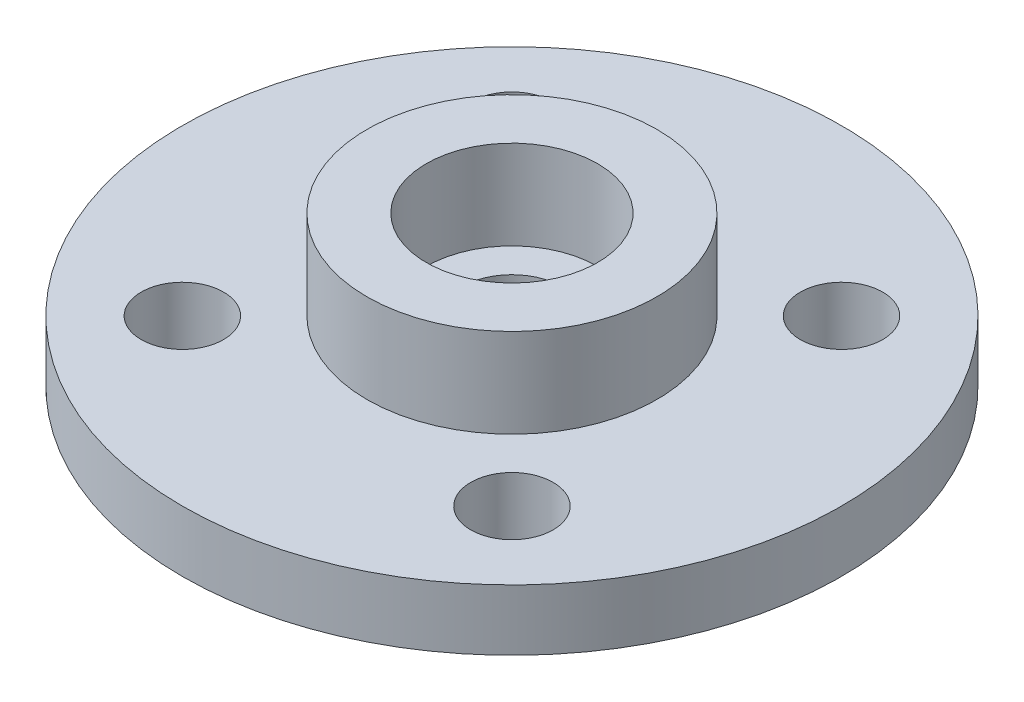
ISO-10303-21;
HEADER;
FILE_DESCRIPTION(('STEP AP214'),'2;1');
FILE_NAME('part.step','',(''),(''),'','','');
FILE_SCHEMA(('AUTOMOTIVE_DESIGN { 1 0 10303 214 1 1 1 1 }'));
ENDSEC;
DATA;
#1=APPLICATION_CONTEXT('core data for automotive mechanical design processes');
#2=APPLICATION_PROTOCOL_DEFINITION('international standard','automotive_design',2000,#1);
#3=PRODUCT_CONTEXT('',#1,'mechanical');
#4=PRODUCT('Part','Part','',(#3));
#5=PRODUCT_RELATED_PRODUCT_CATEGORY('part','',(#4));
#6=PRODUCT_DEFINITION_FORMATION('','',#4);
#7=PRODUCT_DEFINITION_CONTEXT('part definition',#1,'design');
#8=PRODUCT_DEFINITION('design','',#6,#7);
#9=PRODUCT_DEFINITION_SHAPE('','',#8);
#10=(LENGTH_UNIT() NAMED_UNIT(*) SI_UNIT(.MILLI.,.METRE.));
#11=(NAMED_UNIT(*) PLANE_ANGLE_UNIT() SI_UNIT($,.RADIAN.));
#12=(NAMED_UNIT(*) SI_UNIT($,.STERADIAN.) SOLID_ANGLE_UNIT());
#13=UNCERTAINTY_MEASURE_WITH_UNIT(LENGTH_MEASURE(1.E-05),#10,'distance_accuracy_value','');
#14=(GEOMETRIC_REPRESENTATION_CONTEXT(3) GLOBAL_UNCERTAINTY_ASSIGNED_CONTEXT((#13)) GLOBAL_UNIT_ASSIGNED_CONTEXT((#10,
#11,#12)) REPRESENTATION_CONTEXT('',''));
#15=CARTESIAN_POINT('',(0.,0.,0.));
#16=DIRECTION('',(0.,0.,1.));
#17=DIRECTION('',(1.,0.,0.));
#18=AXIS2_PLACEMENT_3D('',#15,#16,#17);
#19=CARTESIAN_POINT('',(0.,1.85,0.));
#20=DIRECTION('',(0.,1.,0.));
#21=DIRECTION('',(0.,0.,1.));
#22=AXIS2_PLACEMENT_3D('',#19,#20,#21);
#23=PLANE('',#22);
#24=CARTESIAN_POINT('',(0.,1.85,0.));
#25=DIRECTION('',(0.,1.,0.));
#26=DIRECTION('',(0.,0.,1.));
#27=AXIS2_PLACEMENT_3D('',#24,#25,#26);
#28=CIRCLE('',#27,1.53);
#29=CARTESIAN_POINT('',(0.,1.85,1.53));
#30=VERTEX_POINT('',#29);
#31=EDGE_CURVE('E43',#30,#30,#28,.T.);
#32=ORIENTED_EDGE('',*,*,#31,.F.);
#33=EDGE_LOOP('',(#32));
#34=FACE_BOUND('',#33,.T.);
#35=CARTESIAN_POINT('',(0.,1.85,0.));
#36=DIRECTION('',(0.,1.,0.));
#37=DIRECTION('',(0.,0.,1.));
#38=AXIS2_PLACEMENT_3D('',#35,#36,#37);
#39=CIRCLE('',#38,2.6);
#40=CARTESIAN_POINT('',(0.,1.85,-2.6));
#41=VERTEX_POINT('',#40);
#42=EDGE_CURVE('E126',#41,#41,#39,.T.);
#43=ORIENTED_EDGE('',*,*,#42,.T.);
#44=EDGE_LOOP('',(#43));
#45=FACE_BOUND('',#44,.T.);
#46=ADVANCED_FACE('F30',(#34,#45),#23,.T.);
#47=CARTESIAN_POINT('',(0.,1.85,0.));
#48=DIRECTION('',(0.,-1.,0.));
#49=DIRECTION('',(0.,0.,-1.));
#50=AXIS2_PLACEMENT_3D('',#47,#48,#49);
#51=CYLINDRICAL_SURFACE('',#50,1.53);
#52=ORIENTED_EDGE('',*,*,#31,.T.);
#53=EDGE_LOOP('',(#52));
#54=FACE_BOUND('',#53,.T.);
#55=CARTESIAN_POINT('',(0.,0.,0.));
#56=DIRECTION('',(0.,1.,0.));
#57=DIRECTION('',(0.,0.,1.));
#58=AXIS2_PLACEMENT_3D('',#55,#56,#57);
#59=CIRCLE('',#58,1.53);
#60=CARTESIAN_POINT('',(0.,0.,1.53));
#61=VERTEX_POINT('',#60);
#62=EDGE_CURVE('E74',#61,#61,#59,.T.);
#63=ORIENTED_EDGE('',*,*,#62,.F.);
#64=EDGE_LOOP('',(#63));
#65=FACE_BOUND('',#64,.T.);
#66=ADVANCED_FACE('F101',(#54,#65),#51,.F.);
#67=CARTESIAN_POINT('',(-5.,1.85,-5.));
#68=DIRECTION('',(0.,-1.,0.));
#69=DIRECTION('',(0.,0.,-1.));
#70=AXIS2_PLACEMENT_3D('',#67,#68,#69);
#71=CYLINDRICAL_SURFACE('',#70,1.25);
#72=CARTESIAN_POINT('',(-5.,1.85,-5.));
#73=DIRECTION('',(0.,1.,0.));
#74=DIRECTION('',(0.,0.,1.));
#75=AXIS2_PLACEMENT_3D('',#72,#73,#74);
#76=CIRCLE('',#75,1.25);
#77=CARTESIAN_POINT('',(-5.,1.85,-3.75));
#78=VERTEX_POINT('',#77);
#79=EDGE_CURVE('E58',#78,#78,#76,.T.);
#80=ORIENTED_EDGE('',*,*,#79,.T.);
#81=EDGE_LOOP('',(#80));
#82=FACE_BOUND('',#81,.T.);
#83=CARTESIAN_POINT('',(-5.,0.,-5.));
#84=DIRECTION('',(0.,1.,0.));
#85=DIRECTION('',(0.,0.,1.));
#86=AXIS2_PLACEMENT_3D('',#83,#84,#85);
#87=CIRCLE('',#86,1.25);
#88=CARTESIAN_POINT('',(-5.,0.,-3.75));
#89=VERTEX_POINT('',#88);
#90=EDGE_CURVE('E72',#89,#89,#87,.T.);
#91=ORIENTED_EDGE('',*,*,#90,.F.);
#92=EDGE_LOOP('',(#91));
#93=FACE_BOUND('',#92,.T.);
#94=ADVANCED_FACE('F106',(#82,#93),#71,.F.);
#95=CARTESIAN_POINT('',(-5.,1.85,5.));
#96=DIRECTION('',(0.,-1.,0.));
#97=DIRECTION('',(0.,0.,-1.));
#98=AXIS2_PLACEMENT_3D('',#95,#96,#97);
#99=CYLINDRICAL_SURFACE('',#98,1.25);
#100=CARTESIAN_POINT('',(-5.,1.85,5.));
#101=DIRECTION('',(0.,1.,0.));
#102=DIRECTION('',(0.,0.,1.));
#103=AXIS2_PLACEMENT_3D('',#100,#101,#102);
#104=CIRCLE('',#103,1.25);
#105=CARTESIAN_POINT('',(-5.,1.85,6.25));
#106=VERTEX_POINT('',#105);
#107=EDGE_CURVE('E55',#106,#106,#104,.T.);
#108=ORIENTED_EDGE('',*,*,#107,.T.);
#109=EDGE_LOOP('',(#108));
#110=FACE_BOUND('',#109,.T.);
#111=CARTESIAN_POINT('',(-5.,0.,5.));
#112=DIRECTION('',(0.,1.,0.));
#113=DIRECTION('',(0.,0.,1.));
#114=AXIS2_PLACEMENT_3D('',#111,#112,#113);
#115=CIRCLE('',#114,1.25);
#116=CARTESIAN_POINT('',(-5.,0.,6.25));
#117=VERTEX_POINT('',#116);
#118=EDGE_CURVE('E69',#117,#117,#115,.T.);
#119=ORIENTED_EDGE('',*,*,#118,.F.);
#120=EDGE_LOOP('',(#119));
#121=FACE_BOUND('',#120,.T.);
#122=ADVANCED_FACE('F182',(#110,#121),#99,.F.);
#123=CARTESIAN_POINT('',(5.,1.85,-5.));
#124=DIRECTION('',(0.,-1.,0.));
#125=DIRECTION('',(0.,0.,-1.));
#126=AXIS2_PLACEMENT_3D('',#123,#124,#125);
#127=CYLINDRICAL_SURFACE('',#126,1.25);
#128=CARTESIAN_POINT('',(5.,1.85,-5.));
#129=DIRECTION('',(0.,1.,0.));
#130=DIRECTION('',(0.,0.,1.));
#131=AXIS2_PLACEMENT_3D('',#128,#129,#130);
#132=CIRCLE('',#131,1.25);
#133=CARTESIAN_POINT('',(5.,1.85,-3.75));
#134=VERTEX_POINT('',#133);
#135=EDGE_CURVE('E52',#134,#134,#132,.T.);
#136=ORIENTED_EDGE('',*,*,#135,.T.);
#137=EDGE_LOOP('',(#136));
#138=FACE_BOUND('',#137,.T.);
#139=CARTESIAN_POINT('',(5.,0.,-5.));
#140=DIRECTION('',(0.,1.,0.));
#141=DIRECTION('',(0.,0.,1.));
#142=AXIS2_PLACEMENT_3D('',#139,#140,#141);
#143=CIRCLE('',#142,1.25);
#144=CARTESIAN_POINT('',(5.,0.,-3.75));
#145=VERTEX_POINT('',#144);
#146=EDGE_CURVE('E66',#145,#145,#143,.T.);
#147=ORIENTED_EDGE('',*,*,#146,.F.);
#148=EDGE_LOOP('',(#147));
#149=FACE_BOUND('',#148,.T.);
#150=ADVANCED_FACE('F173',(#138,#149),#127,.F.);
#151=CARTESIAN_POINT('',(5.,1.85,5.));
#152=DIRECTION('',(0.,-1.,0.));
#153=DIRECTION('',(0.,0.,-1.));
#154=AXIS2_PLACEMENT_3D('',#151,#152,#153);
#155=CYLINDRICAL_SURFACE('',#154,1.25);
#156=CARTESIAN_POINT('',(5.,1.85,5.));
#157=DIRECTION('',(0.,1.,0.));
#158=DIRECTION('',(0.,0.,1.));
#159=AXIS2_PLACEMENT_3D('',#156,#157,#158);
#160=CIRCLE('',#159,1.25);
#161=CARTESIAN_POINT('',(5.,1.85,6.25));
#162=VERTEX_POINT('',#161);
#163=EDGE_CURVE('E49',#162,#162,#160,.T.);
#164=ORIENTED_EDGE('',*,*,#163,.T.);
#165=EDGE_LOOP('',(#164));
#166=FACE_BOUND('',#165,.T.);
#167=CARTESIAN_POINT('',(5.,0.,5.));
#168=DIRECTION('',(0.,1.,0.));
#169=DIRECTION('',(0.,0.,1.));
#170=AXIS2_PLACEMENT_3D('',#167,#168,#169);
#171=CIRCLE('',#170,1.25);
#172=CARTESIAN_POINT('',(5.,0.,6.25));
#173=VERTEX_POINT('',#172);
#174=EDGE_CURVE('E63',#173,#173,#171,.T.);
#175=ORIENTED_EDGE('',*,*,#174,.F.);
#176=EDGE_LOOP('',(#175));
#177=FACE_BOUND('',#176,.T.);
#178=ADVANCED_FACE('F32',(#166,#177),#155,.F.);
#179=CARTESIAN_POINT('',(0.,1.85,0.));
#180=DIRECTION('',(0.,-1.,0.));
#181=DIRECTION('',(0.,0.,-1.));
#182=AXIS2_PLACEMENT_3D('',#179,#180,#181);
#183=CYLINDRICAL_SURFACE('',#182,10.);
#184=CARTESIAN_POINT('',(0.,1.85,0.));
#185=DIRECTION('',(0.,1.,0.));
#186=DIRECTION('',(0.,0.,1.));
#187=AXIS2_PLACEMENT_3D('',#184,#185,#186);
#188=CIRCLE('',#187,10.);
#189=CARTESIAN_POINT('',(0.,1.85,10.));
#190=VERTEX_POINT('',#189);
#191=EDGE_CURVE('E38',#190,#190,#188,.T.);
#192=ORIENTED_EDGE('',*,*,#191,.F.);
#193=EDGE_LOOP('',(#192));
#194=FACE_BOUND('',#193,.T.);
#195=CARTESIAN_POINT('',(0.,0.,0.));
#196=DIRECTION('',(0.,1.,0.));
#197=DIRECTION('',(0.,0.,1.));
#198=AXIS2_PLACEMENT_3D('',#195,#196,#197);
#199=CIRCLE('',#198,10.);
#200=CARTESIAN_POINT('',(0.,0.,10.));
#201=VERTEX_POINT('',#200);
#202=EDGE_CURVE('E34',#201,#201,#199,.T.);
#203=ORIENTED_EDGE('',*,*,#202,.T.);
#204=EDGE_LOOP('',(#203));
#205=FACE_BOUND('',#204,.T.);
#206=ADVANCED_FACE('F81',(#194,#205),#183,.T.);
#207=CARTESIAN_POINT('',(0.,1.85,0.));
#208=DIRECTION('',(0.,1.,0.));
#209=DIRECTION('',(0.,0.,1.));
#210=AXIS2_PLACEMENT_3D('',#207,#208,#209);
#211=CIRCLE('',#210,4.4);
#212=CARTESIAN_POINT('',(0.,1.85,-4.4));
#213=VERTEX_POINT('',#212);
#214=EDGE_CURVE('E10',#213,#213,#211,.T.);
#215=ORIENTED_EDGE('',*,*,#214,.F.);
#216=EDGE_LOOP('',(#215));
#217=FACE_BOUND('',#216,.T.);
#218=ORIENTED_EDGE('',*,*,#163,.F.);
#219=EDGE_LOOP('',(#218));
#220=FACE_BOUND('',#219,.T.);
#221=ORIENTED_EDGE('',*,*,#135,.F.);
#222=EDGE_LOOP('',(#221));
#223=FACE_BOUND('',#222,.T.);
#224=ORIENTED_EDGE('',*,*,#107,.F.);
#225=EDGE_LOOP('',(#224));
#226=FACE_BOUND('',#225,.T.);
#227=ORIENTED_EDGE('',*,*,#79,.F.);
#228=EDGE_LOOP('',(#227));
#229=FACE_BOUND('',#228,.T.);
#230=ORIENTED_EDGE('',*,*,#191,.T.);
#231=EDGE_LOOP('',(#230));
#232=FACE_BOUND('',#231,.T.);
#233=ADVANCED_FACE('F86',(#217,#220,#223,#226,#229,#232),#23,.T.);
#234=CARTESIAN_POINT('',(0.,0.,0.));
#235=DIRECTION('',(0.,1.,0.));
#236=DIRECTION('',(0.,0.,1.));
#237=AXIS2_PLACEMENT_3D('',#234,#235,#236);
#238=PLANE('',#237);
#239=ORIENTED_EDGE('',*,*,#174,.T.);
#240=EDGE_LOOP('',(#239));
#241=FACE_BOUND('',#240,.T.);
#242=ORIENTED_EDGE('',*,*,#146,.T.);
#243=EDGE_LOOP('',(#242));
#244=FACE_BOUND('',#243,.T.);
#245=ORIENTED_EDGE('',*,*,#118,.T.);
#246=EDGE_LOOP('',(#245));
#247=FACE_BOUND('',#246,.T.);
#248=ORIENTED_EDGE('',*,*,#90,.T.);
#249=EDGE_LOOP('',(#248));
#250=FACE_BOUND('',#249,.T.);
#251=ORIENTED_EDGE('',*,*,#62,.T.);
#252=EDGE_LOOP('',(#251));
#253=FACE_BOUND('',#252,.T.);
#254=ORIENTED_EDGE('',*,*,#202,.F.);
#255=EDGE_LOOP('',(#254));
#256=FACE_BOUND('',#255,.T.);
#257=ADVANCED_FACE('F83',(#241,#244,#247,#250,#253,#256),#238,.F.);
#258=CARTESIAN_POINT('',(0.,4.55,0.));
#259=DIRECTION('',(0.,1.,0.));
#260=DIRECTION('',(0.,0.,1.));
#261=AXIS2_PLACEMENT_3D('',#258,#259,#260);
#262=PLANE('',#261);
#263=CARTESIAN_POINT('',(0.,4.55,0.));
#264=DIRECTION('',(0.,1.,0.));
#265=DIRECTION('',(0.,0.,1.));
#266=AXIS2_PLACEMENT_3D('',#263,#264,#265);
#267=CIRCLE('',#266,4.4);
#268=CARTESIAN_POINT('',(0.,4.55,-4.4));
#269=VERTEX_POINT('',#268);
#270=EDGE_CURVE('E47',#269,#269,#267,.T.);
#271=ORIENTED_EDGE('',*,*,#270,.T.);
#272=EDGE_LOOP('',(#271));
#273=FACE_BOUND('',#272,.T.);
#274=CARTESIAN_POINT('',(0.,4.55,0.));
#275=DIRECTION('',(0.,1.,0.));
#276=DIRECTION('',(0.,0.,1.));
#277=AXIS2_PLACEMENT_3D('',#274,#275,#276);
#278=CIRCLE('',#277,2.6);
#279=CARTESIAN_POINT('',(0.,4.55,-2.6));
#280=VERTEX_POINT('',#279);
#281=EDGE_CURVE('E123',#280,#280,#278,.T.);
#282=ORIENTED_EDGE('',*,*,#281,.F.);
#283=EDGE_LOOP('',(#282));
#284=FACE_BOUND('',#283,.T.);
#285=ADVANCED_FACE('F85',(#273,#284),#262,.T.);
#286=CARTESIAN_POINT('',(0.,4.55,0.));
#287=DIRECTION('',(0.,-1.,0.));
#288=DIRECTION('',(0.,0.,-1.));
#289=AXIS2_PLACEMENT_3D('',#286,#287,#288);
#290=CYLINDRICAL_SURFACE('',#289,4.4);
#291=CARTESIAN_POINT('',(0.,4.55,-4.4));
#292=CARTESIAN_POINT('',(0.,4.521875,-4.4));
#293=CARTESIAN_POINT('',(0.,4.49375,-4.4));
#294=CARTESIAN_POINT('',(0.,4.4375,-4.4));
#295=CARTESIAN_POINT('',(0.,4.409375,-4.4));
#296=CARTESIAN_POINT('',(0.,4.353125,-4.4));
#297=CARTESIAN_POINT('',(0.,4.325,-4.4));
#298=CARTESIAN_POINT('',(0.,4.26875,-4.4));
#299=CARTESIAN_POINT('',(0.,4.240625,-4.4));
#300=CARTESIAN_POINT('',(0.,4.184375,-4.4));
#301=CARTESIAN_POINT('',(0.,4.15625,-4.4));
#302=CARTESIAN_POINT('',(0.,4.1,-4.4));
#303=CARTESIAN_POINT('',(0.,4.071875,-4.4));
#304=CARTESIAN_POINT('',(0.,4.015625,-4.4));
#305=CARTESIAN_POINT('',(0.,3.9875,-4.4));
#306=CARTESIAN_POINT('',(0.,3.93125,-4.4));
#307=CARTESIAN_POINT('',(0.,3.903125,-4.4));
#308=CARTESIAN_POINT('',(0.,3.846875,-4.4));
#309=CARTESIAN_POINT('',(0.,3.81875,-4.4));
#310=CARTESIAN_POINT('',(0.,3.7625,-4.4));
#311=CARTESIAN_POINT('',(0.,3.734375,-4.4));
#312=CARTESIAN_POINT('',(0.,3.678125,-4.4));
#313=CARTESIAN_POINT('',(0.,3.65,-4.4));
#314=CARTESIAN_POINT('',(0.,3.59375,-4.4));
#315=CARTESIAN_POINT('',(0.,3.565625,-4.4));
#316=CARTESIAN_POINT('',(0.,3.509375,-4.4));
#317=CARTESIAN_POINT('',(0.,3.48125,-4.4));
#318=CARTESIAN_POINT('',(0.,3.425,-4.4));
#319=CARTESIAN_POINT('',(0.,3.396875,-4.4));
#320=CARTESIAN_POINT('',(0.,3.340625,-4.4));
#321=CARTESIAN_POINT('',(0.,3.3125,-4.4));
#322=CARTESIAN_POINT('',(0.,3.25625,-4.4));
#323=CARTESIAN_POINT('',(0.,3.228125,-4.4));
#324=CARTESIAN_POINT('',(0.,3.171875,-4.4));
#325=CARTESIAN_POINT('',(0.,3.14375,-4.4));
#326=CARTESIAN_POINT('',(0.,3.0875,-4.4));
#327=CARTESIAN_POINT('',(0.,3.059375,-4.4));
#328=CARTESIAN_POINT('',(0.,3.003125,-4.4));
#329=CARTESIAN_POINT('',(0.,2.975,-4.4));
#330=CARTESIAN_POINT('',(0.,2.91875,-4.4));
#331=CARTESIAN_POINT('',(0.,2.890625,-4.4));
#332=CARTESIAN_POINT('',(0.,2.834375,-4.4));
#333=CARTESIAN_POINT('',(0.,2.80625,-4.4));
#334=CARTESIAN_POINT('',(0.,2.75,-4.4));
#335=CARTESIAN_POINT('',(0.,2.721875,-4.4));
#336=CARTESIAN_POINT('',(0.,2.665625,-4.4));
#337=CARTESIAN_POINT('',(0.,2.6375,-4.4));
#338=CARTESIAN_POINT('',(0.,2.58125,-4.4));
#339=CARTESIAN_POINT('',(0.,2.553125,-4.4));
#340=CARTESIAN_POINT('',(0.,2.496875,-4.4));
#341=CARTESIAN_POINT('',(0.,2.46875,-4.4));
#342=CARTESIAN_POINT('',(0.,2.4125,-4.4));
#343=CARTESIAN_POINT('',(0.,2.384375,-4.4));
#344=CARTESIAN_POINT('',(0.,2.328125,-4.4));
#345=CARTESIAN_POINT('',(0.,2.3,-4.4));
#346=CARTESIAN_POINT('',(0.,2.24375,-4.4));
#347=CARTESIAN_POINT('',(0.,2.215625,-4.4));
#348=CARTESIAN_POINT('',(0.,2.159375,-4.4));
#349=CARTESIAN_POINT('',(0.,2.13125,-4.4));
#350=CARTESIAN_POINT('',(0.,2.075,-4.4));
#351=CARTESIAN_POINT('',(0.,2.046875,-4.4));
#352=CARTESIAN_POINT('',(0.,1.990625,-4.4));
#353=CARTESIAN_POINT('',(0.,1.9625,-4.4));
#354=CARTESIAN_POINT('',(0.,1.90625,-4.4));
#355=CARTESIAN_POINT('',(0.,1.878125,-4.4));
#356=CARTESIAN_POINT('',(0.,1.85,-4.4));
#357=B_SPLINE_CURVE_WITH_KNOTS('',3,(#291,#292,#293,#294,#295,#296,#297,#298,#299,#300,#301,
#302,#303,#304,#305,#306,#307,#308,#309,#310,#311,#312,#313,#314,#315,#316,#317,#318,#319,#320,
#321,#322,#323,#324,#325,#326,#327,#328,#329,#330,#331,#332,#333,#334,#335,#336,#337,#338,#339,
#340,#341,#342,#343,#344,#345,#346,#347,#348,#349,#350,#351,#352,#353,#354,#355,#356),
.UNSPECIFIED.,.F.,.F.,(4,2,2,2,2,2,2,2,2,2,2,2,2,2,2,2,2,2,2,2,2,2,2,2,2,2,2,2,2,2,2,2,4),(0.,
0.0843749999999994,0.16875,0.253125,0.337499999999999,0.421875,0.50625,0.590625,
0.674999999999999,0.759375,0.84375,0.928125,1.0125,1.096875,1.18125,1.265625,1.35,1.434375,
1.51875,1.603125,1.6875,1.771875,1.85625,1.940625,2.025,2.109375,2.19375,2.278125,2.3625,
2.446875,2.53125,2.615625,2.7),.UNSPECIFIED.);
#358=EDGE_CURVE('BSEAM93',#269,#213,#357,.T.);
#359=ORIENTED_EDGE('',*,*,#270,.F.);
#360=ORIENTED_EDGE('',*,*,#214,.T.);
#361=ORIENTED_EDGE('',*,*,#358,.T.);
#362=ORIENTED_EDGE('',*,*,#358,.F.);
#363=EDGE_LOOP('',(#359,#361,#360,#362));
#364=FACE_BOUND('',#363,.T.);
#365=ADVANCED_FACE('F93',(#364),#290,.T.);
#366=CARTESIAN_POINT('',(0.,4.55,0.));
#367=DIRECTION('',(0.,-1.,0.));
#368=DIRECTION('',(0.,0.,-1.));
#369=AXIS2_PLACEMENT_3D('',#366,#367,#368);
#370=CYLINDRICAL_SURFACE('',#369,2.6);
#371=CARTESIAN_POINT('',(0.,4.55,-2.6));
#372=CARTESIAN_POINT('',(0.,4.521875,-2.6));
#373=CARTESIAN_POINT('',(0.,4.49375,-2.6));
#374=CARTESIAN_POINT('',(0.,4.4375,-2.6));
#375=CARTESIAN_POINT('',(0.,4.409375,-2.6));
#376=CARTESIAN_POINT('',(0.,4.353125,-2.6));
#377=CARTESIAN_POINT('',(0.,4.325,-2.6));
#378=CARTESIAN_POINT('',(0.,4.26875,-2.6));
#379=CARTESIAN_POINT('',(0.,4.240625,-2.6));
#380=CARTESIAN_POINT('',(0.,4.184375,-2.6));
#381=CARTESIAN_POINT('',(0.,4.15625,-2.6));
#382=CARTESIAN_POINT('',(0.,4.1,-2.6));
#383=CARTESIAN_POINT('',(0.,4.071875,-2.6));
#384=CARTESIAN_POINT('',(0.,4.015625,-2.6));
#385=CARTESIAN_POINT('',(0.,3.9875,-2.6));
#386=CARTESIAN_POINT('',(0.,3.93125,-2.6));
#387=CARTESIAN_POINT('',(0.,3.903125,-2.6));
#388=CARTESIAN_POINT('',(0.,3.846875,-2.6));
#389=CARTESIAN_POINT('',(0.,3.81875,-2.6));
#390=CARTESIAN_POINT('',(0.,3.7625,-2.6));
#391=CARTESIAN_POINT('',(0.,3.734375,-2.6));
#392=CARTESIAN_POINT('',(0.,3.678125,-2.6));
#393=CARTESIAN_POINT('',(0.,3.65,-2.6));
#394=CARTESIAN_POINT('',(0.,3.59375,-2.6));
#395=CARTESIAN_POINT('',(0.,3.565625,-2.6));
#396=CARTESIAN_POINT('',(0.,3.509375,-2.6));
#397=CARTESIAN_POINT('',(0.,3.48125,-2.6));
#398=CARTESIAN_POINT('',(0.,3.425,-2.6));
#399=CARTESIAN_POINT('',(0.,3.396875,-2.6));
#400=CARTESIAN_POINT('',(0.,3.340625,-2.6));
#401=CARTESIAN_POINT('',(0.,3.3125,-2.6));
#402=CARTESIAN_POINT('',(0.,3.25625,-2.6));
#403=CARTESIAN_POINT('',(0.,3.228125,-2.6));
#404=CARTESIAN_POINT('',(0.,3.171875,-2.6));
#405=CARTESIAN_POINT('',(0.,3.14375,-2.6));
#406=CARTESIAN_POINT('',(0.,3.0875,-2.6));
#407=CARTESIAN_POINT('',(0.,3.059375,-2.6));
#408=CARTESIAN_POINT('',(0.,3.003125,-2.6));
#409=CARTESIAN_POINT('',(0.,2.975,-2.6));
#410=CARTESIAN_POINT('',(0.,2.91875,-2.6));
#411=CARTESIAN_POINT('',(0.,2.890625,-2.6));
#412=CARTESIAN_POINT('',(0.,2.834375,-2.6));
#413=CARTESIAN_POINT('',(0.,2.80625,-2.6));
#414=CARTESIAN_POINT('',(0.,2.75,-2.6));
#415=CARTESIAN_POINT('',(0.,2.721875,-2.6));
#416=CARTESIAN_POINT('',(0.,2.665625,-2.6));
#417=CARTESIAN_POINT('',(0.,2.6375,-2.6));
#418=CARTESIAN_POINT('',(0.,2.58125,-2.6));
#419=CARTESIAN_POINT('',(0.,2.553125,-2.6));
#420=CARTESIAN_POINT('',(0.,2.496875,-2.6));
#421=CARTESIAN_POINT('',(0.,2.46875,-2.6));
#422=CARTESIAN_POINT('',(0.,2.4125,-2.6));
#423=CARTESIAN_POINT('',(0.,2.384375,-2.6));
#424=CARTESIAN_POINT('',(0.,2.328125,-2.6));
#425=CARTESIAN_POINT('',(0.,2.3,-2.6));
#426=CARTESIAN_POINT('',(0.,2.24375,-2.6));
#427=CARTESIAN_POINT('',(0.,2.215625,-2.6));
#428=CARTESIAN_POINT('',(0.,2.159375,-2.6));
#429=CARTESIAN_POINT('',(0.,2.13125,-2.6));
#430=CARTESIAN_POINT('',(0.,2.075,-2.6));
#431=CARTESIAN_POINT('',(0.,2.046875,-2.6));
#432=CARTESIAN_POINT('',(0.,1.990625,-2.6));
#433=CARTESIAN_POINT('',(0.,1.9625,-2.6));
#434=CARTESIAN_POINT('',(0.,1.90625,-2.6));
#435=CARTESIAN_POINT('',(0.,1.878125,-2.6));
#436=CARTESIAN_POINT('',(0.,1.85,-2.6));
#437=B_SPLINE_CURVE_WITH_KNOTS('',3,(#371,#372,#373,#374,#375,#376,#377,#378,#379,#380,#381,
#382,#383,#384,#385,#386,#387,#388,#389,#390,#391,#392,#393,#394,#395,#396,#397,#398,#399,#400,
#401,#402,#403,#404,#405,#406,#407,#408,#409,#410,#411,#412,#413,#414,#415,#416,#417,#418,#419,
#420,#421,#422,#423,#424,#425,#426,#427,#428,#429,#430,#431,#432,#433,#434,#435,#436),
.UNSPECIFIED.,.F.,.F.,(4,2,2,2,2,2,2,2,2,2,2,2,2,2,2,2,2,2,2,2,2,2,2,2,2,2,2,2,2,2,2,2,4),(0.,
0.0843749999999994,0.16875,0.253125,0.337499999999999,0.421875,0.50625,0.590625,
0.674999999999999,0.759375,0.84375,0.928125,1.0125,1.096875,1.18125,1.265625,1.35,1.434375,
1.51875,1.603125,1.6875,1.771875,1.85625,1.940625,2.025,2.109375,2.19375,2.278125,2.3625,
2.446875,2.53125,2.615625,2.7),.UNSPECIFIED.);
#438=EDGE_CURVE('BSEAM113',#280,#41,#437,.T.);
#439=ORIENTED_EDGE('',*,*,#281,.T.);
#440=ORIENTED_EDGE('',*,*,#42,.F.);
#441=ORIENTED_EDGE('',*,*,#438,.T.);
#442=ORIENTED_EDGE('',*,*,#438,.F.);
#443=EDGE_LOOP('',(#439,#441,#440,#442));
#444=FACE_BOUND('',#443,.T.);
#445=ADVANCED_FACE('F113',(#444),#370,.F.);
#446=CLOSED_SHELL('',(#46,#66,#94,#122,#150,#178,#206,#233,#257,#285,#365,#445));
#447=MANIFOLD_SOLID_BREP('B2',#446);
#448=ADVANCED_BREP_SHAPE_REPRESENTATION('',(#18,#447),#14);
#449=SHAPE_DEFINITION_REPRESENTATION(#9,#448);
ENDSEC;
END-ISO-10303-21;
